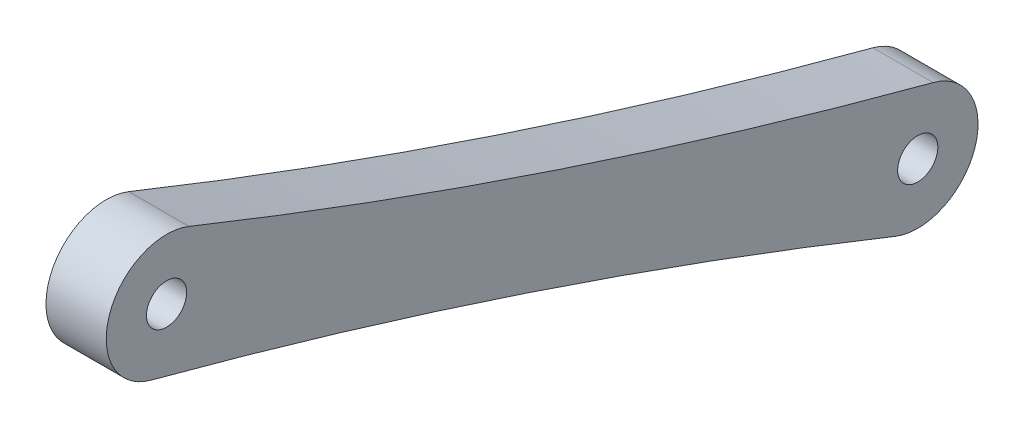
ISO-10303-21;
HEADER;
FILE_DESCRIPTION(('STEP AP214'),'2;1');
FILE_NAME('part.step','',(''),(''),'','','');
FILE_SCHEMA(('AUTOMOTIVE_DESIGN { 1 0 10303 214 1 1 1 1 }'));
ENDSEC;
DATA;
#1=APPLICATION_CONTEXT('core data for automotive mechanical design processes');
#2=APPLICATION_PROTOCOL_DEFINITION('international standard','automotive_design',2000,#1);
#3=PRODUCT_CONTEXT('',#1,'mechanical');
#4=PRODUCT('Part','Part','',(#3));
#5=PRODUCT_RELATED_PRODUCT_CATEGORY('part','',(#4));
#6=PRODUCT_DEFINITION_FORMATION('','',#4);
#7=PRODUCT_DEFINITION_CONTEXT('part definition',#1,'design');
#8=PRODUCT_DEFINITION('design','',#6,#7);
#9=PRODUCT_DEFINITION_SHAPE('','',#8);
#10=(LENGTH_UNIT() NAMED_UNIT(*) SI_UNIT(.MILLI.,.METRE.));
#11=(NAMED_UNIT(*) PLANE_ANGLE_UNIT() SI_UNIT($,.RADIAN.));
#12=(NAMED_UNIT(*) SI_UNIT($,.STERADIAN.) SOLID_ANGLE_UNIT());
#13=UNCERTAINTY_MEASURE_WITH_UNIT(LENGTH_MEASURE(1.E-05),#10,'distance_accuracy_value','');
#14=(GEOMETRIC_REPRESENTATION_CONTEXT(3) GLOBAL_UNCERTAINTY_ASSIGNED_CONTEXT((#13)) GLOBAL_UNIT_ASSIGNED_CONTEXT((#10,
#11,#12)) REPRESENTATION_CONTEXT('',''));
#15=CARTESIAN_POINT('',(0.,0.,0.));
#16=DIRECTION('',(0.,0.,1.));
#17=DIRECTION('',(1.,0.,0.));
#18=AXIS2_PLACEMENT_3D('',#15,#16,#17);
#19=CARTESIAN_POINT('',(4.5,-15.2683405910264,131.347908141366));
#20=DIRECTION('',(1.,0.,0.));
#21=DIRECTION('',(0.,0.,-1.));
#22=AXIS2_PLACEMENT_3D('',#19,#20,#21);
#23=PLANE('',#22);
#24=CARTESIAN_POINT('',(4.5,21.2911288267884,56.9042323272972));
#25=DIRECTION('',(1.,0.,0.));
#26=DIRECTION('',(0.,0.,-1.));
#27=AXIS2_PLACEMENT_3D('',#24,#25,#26);
#28=CIRCLE('',#27,2.);
#29=CARTESIAN_POINT('',(4.5,21.2911288267884,54.9042323272972));
#30=VERTEX_POINT('',#29);
#31=EDGE_CURVE('E145',#30,#30,#28,.T.);
#32=ORIENTED_EDGE('',*,*,#31,.F.);
#33=EDGE_LOOP('',(#32));
#34=FACE_BOUND('',#33,.T.);
#35=CARTESIAN_POINT('',(4.5,46.1615189959735,131.676578103209));
#36=DIRECTION('',(1.,0.,0.));
#37=DIRECTION('',(0.,0.,-1.));
#38=AXIS2_PLACEMENT_3D('',#35,#36,#37);
#39=CIRCLE('',#38,2.);
#40=CARTESIAN_POINT('',(4.5,46.1615189959735,129.676578103209));
#41=VERTEX_POINT('',#40);
#42=EDGE_CURVE('E11',#41,#41,#39,.T.);
#43=ORIENTED_EDGE('',*,*,#42,.F.);
#44=EDGE_LOOP('',(#43));
#45=FACE_BOUND('',#44,.T.);
#46=CARTESIAN_POINT('',(4.500012,-579.563161210761,298.279575587918));
#47=DIRECTION('',(1.,0.,0.));
#48=DIRECTION('',(0.,0.927925231399743,-0.372766367758324));
#49=AXIS2_PLACEMENT_3D('',#46,#47,#48);
#50=CIRCLE('',#49,641.524466094302);
#51=CARTESIAN_POINT('',(4.500006,15.7235774383901,59.1408305338471));
#52=VERTEX_POINT('',#51);
#53=CARTESIAN_POINT('',(4.500006,40.3635171013337,133.220331331466));
#54=VERTEX_POINT('',#53);
#55=EDGE_CURVE('E93',#52,#54,#50,.T.);
#56=ORIENTED_EDGE('',*,*,#55,.F.);
#57=CARTESIAN_POINT('',(4.5,15.7235774383901,59.1408305338471));
#58=CARTESIAN_POINT('',(4.5,15.2610132520388,57.9893720955806));
#59=CARTESIAN_POINT('',(4.5,15.2931536580102,56.7483674027068));
#60=CARTESIAN_POINT('',(4.5,15.3252739648481,55.5081387771579));
#61=CARTESIAN_POINT('',(4.5,15.8472549267216,54.3814883925768));
#62=CARTESIAN_POINT('',(4.5,16.3687944917824,53.2557907245217));
#63=CARTESIAN_POINT('',(4.5,17.2949294543903,52.4286998923748));
#64=CARTESIAN_POINT('',(4.5,18.2202812600406,51.6023084636258));
#65=CARTESIAN_POINT('',(4.5,19.3985517431916,51.2105382731139));
#66=CARTESIAN_POINT('',(4.5,20.5758258588578,50.8190993707782));
#67=CARTESIAN_POINT('',(4.5,21.8128271263633,50.9269561178337));
#68=CARTESIAN_POINT('',(4.5,23.0487823625095,51.0347216592108));
#69=CARTESIAN_POINT('',(4.5,24.1414694367818,51.6245014243988));
#70=CARTESIAN_POINT('',(4.5,25.2332325144706,52.2137824608099));
#71=CARTESIAN_POINT('',(4.5,26.0022485683748,53.1886770820568));
#72=CARTESIAN_POINT('',(4.5,26.7707838957218,54.1629622781397));
#73=CARTESIAN_POINT('',(4.5,27.089730834885,55.3627347594444));
#74=B_SPLINE_CURVE_WITH_KNOTS('',2,(#57,#58,#59,#60,#61,#62,#63,#64,#65,#66,#67,#68,#69,#70,#71,
#72,#73),.UNSPECIFIED.,.F.,.F.,(3,2,2,2,2,2,2,2,3),(0.,0.125,0.25,0.375,0.5,0.625,0.75,0.875,
1.),.UNSPECIFIED.);
#75=CARTESIAN_POINT('',(4.500006,27.089730834885,55.3627347594445));
#76=VERTEX_POINT('',#75);
#77=EDGE_CURVE('E99',#52,#76,#74,.T.);
#78=ORIENTED_EDGE('',*,*,#77,.T.);
#79=CARTESIAN_POINT('',(4.500012,643.112426075408,-108.400442145868));
#80=DIRECTION('',(1.,0.,0.));
#81=DIRECTION('',(0.,-0.927780147297956,0.373127321808231));
#82=AXIS2_PLACEMENT_3D('',#79,#80,#81);
#83=CIRCLE('',#82,637.418496093044);
#84=CARTESIAN_POINT('',(4.500006,51.7281998797612,129.43781417236));
#85=VERTEX_POINT('',#84);
#86=EDGE_CURVE('E142',#85,#76,#83,.T.);
#87=ORIENTED_EDGE('',*,*,#86,.F.);
#88=CARTESIAN_POINT('',(4.5,51.7281998797612,129.43781417236));
#89=CARTESIAN_POINT('',(4.5,52.1912119724456,130.58909257639));
#90=CARTESIAN_POINT('',(4.5,52.1595543455979,131.830109678643));
#91=CARTESIAN_POINT('',(4.5,52.1279165159755,133.07035070582));
#92=CARTESIAN_POINT('',(4.5,51.6063738840846,134.197204066618));
#93=CARTESIAN_POINT('',(4.5,51.0852722783503,135.323104539241));
#94=CARTESIAN_POINT('',(4.5,50.1594591413897,136.150555594622));
#95=CARTESIAN_POINT('',(4.5,49.2344288892583,136.977306941981));
#96=CARTESIAN_POINT('',(4.5,48.0563109020276,137.369535474624));
#97=CARTESIAN_POINT('',(4.5,46.8791891533265,137.761432331509));
#98=CARTESIAN_POINT('',(4.5,45.6421460209102,137.654056811893));
#99=CARTESIAN_POINT('',(4.5,44.4061489552429,137.54677209102));
#100=CARTESIAN_POINT('',(4.5,43.313232527033,136.957417448507));
#101=CARTESIAN_POINT('',(4.5,42.221240289343,136.368561175274));
#102=CARTESIAN_POINT('',(4.5,41.4518450393081,135.393965791076));
#103=CARTESIAN_POINT('',(4.5,40.6829307528644,134.419979644972));
#104=CARTESIAN_POINT('',(4.5,40.3635171013337,133.220331331466));
#105=B_SPLINE_CURVE_WITH_KNOTS('',2,(#88,#89,#90,#91,#92,#93,#94,#95,#96,#97,#98,#99,#100,#101,
#102,#103,#104),.UNSPECIFIED.,.F.,.F.,(3,2,2,2,2,2,2,2,3),(0.,0.125,0.25,0.375,0.5,0.625,0.75,
0.875,1.),.UNSPECIFIED.);
#106=EDGE_CURVE('E65',#85,#54,#105,.T.);
#107=ORIENTED_EDGE('',*,*,#106,.T.);
#108=EDGE_LOOP('',(#56,#78,#87,#107));
#109=FACE_BOUND('',#108,.T.);
#110=ADVANCED_FACE('F42',(#34,#45,#109),#23,.T.);
#111=CARTESIAN_POINT('',(-1.5,-15.2683405910264,131.347908141366));
#112=DIRECTION('',(1.,0.,0.));
#113=DIRECTION('',(0.,0.,-1.));
#114=AXIS2_PLACEMENT_3D('',#111,#112,#113);
#115=PLANE('',#114);
#116=CARTESIAN_POINT('',(-1.5,21.2911288267884,56.9042323272972));
#117=DIRECTION('',(1.,0.,0.));
#118=DIRECTION('',(0.,0.,-1.));
#119=AXIS2_PLACEMENT_3D('',#116,#117,#118);
#120=CIRCLE('',#119,2.);
#121=CARTESIAN_POINT('',(-1.5,21.2911288267884,54.9042323272972));
#122=VERTEX_POINT('',#121);
#123=EDGE_CURVE('E148',#122,#122,#120,.T.);
#124=ORIENTED_EDGE('',*,*,#123,.T.);
#125=EDGE_LOOP('',(#124));
#126=FACE_BOUND('',#125,.T.);
#127=CARTESIAN_POINT('',(-1.5,46.1615189959735,131.676578103209));
#128=DIRECTION('',(1.,0.,0.));
#129=DIRECTION('',(0.,0.,-1.));
#130=AXIS2_PLACEMENT_3D('',#127,#128,#129);
#131=CIRCLE('',#130,2.);
#132=CARTESIAN_POINT('',(-1.5,46.1615189959735,129.676578103209));
#133=VERTEX_POINT('',#132);
#134=EDGE_CURVE('E53',#133,#133,#131,.T.);
#135=ORIENTED_EDGE('',*,*,#134,.T.);
#136=EDGE_LOOP('',(#135));
#137=FACE_BOUND('',#136,.T.);
#138=CARTESIAN_POINT('',(-1.5,21.2911288267884,56.9042323272972));
#139=DIRECTION('',(1.,0.,0.));
#140=DIRECTION('',(0.,0.,-1.));
#141=AXIS2_PLACEMENT_3D('',#138,#139,#140);
#142=CIRCLE('',#141,5.99999999999982);
#143=CARTESIAN_POINT('',(-1.5,15.7235774383901,59.1408305338471));
#144=VERTEX_POINT('',#143);
#145=CARTESIAN_POINT('',(-1.5,27.089730834885,55.3627347594444));
#146=VERTEX_POINT('',#145);
#147=EDGE_CURVE('E223',#144,#146,#142,.T.);
#148=ORIENTED_EDGE('',*,*,#147,.F.);
#149=CARTESIAN_POINT('',(-1.5,-579.563161210761,298.279575587918));
#150=DIRECTION('',(1.,0.,0.));
#151=DIRECTION('',(0.,0.,-1.));
#152=AXIS2_PLACEMENT_3D('',#149,#150,#151);
#153=CIRCLE('',#152,641.524466094302);
#154=CARTESIAN_POINT('',(-1.5,40.3635171013338,133.220331331466));
#155=VERTEX_POINT('',#154);
#156=EDGE_CURVE('E94',#144,#155,#153,.T.);
#157=ORIENTED_EDGE('',*,*,#156,.T.);
#158=CARTESIAN_POINT('',(-1.5,46.1615189959735,131.676578103209));
#159=DIRECTION('',(1.,0.,0.));
#160=DIRECTION('',(0.,0.,-1.));
#161=AXIS2_PLACEMENT_3D('',#158,#159,#160);
#162=CIRCLE('',#161,5.99999999999993);
#163=CARTESIAN_POINT('',(-1.5,51.7281998797612,129.43781417236));
#164=VERTEX_POINT('',#163);
#165=EDGE_CURVE('E229',#164,#155,#162,.T.);
#166=ORIENTED_EDGE('',*,*,#165,.F.);
#167=CARTESIAN_POINT('',(-1.5,643.112426075408,-108.400442145868));
#168=DIRECTION('',(1.,0.,0.));
#169=DIRECTION('',(0.,0.,-1.));
#170=AXIS2_PLACEMENT_3D('',#167,#168,#169);
#171=CIRCLE('',#170,637.418496093044);
#172=EDGE_CURVE('E100',#164,#146,#171,.T.);
#173=ORIENTED_EDGE('',*,*,#172,.T.);
#174=EDGE_LOOP('',(#148,#157,#166,#173));
#175=FACE_BOUND('',#174,.T.);
#176=ADVANCED_FACE('F46',(#126,#137,#175),#115,.F.);
#177=CARTESIAN_POINT('',(4.5,46.1615189959735,131.676578103209));
#178=DIRECTION('',(-1.,0.,0.));
#179=DIRECTION('',(0.,0.,1.));
#180=AXIS2_PLACEMENT_3D('',#177,#178,#179);
#181=CYLINDRICAL_SURFACE('',#180,2.);
#182=ORIENTED_EDGE('',*,*,#42,.T.);
#183=EDGE_LOOP('',(#182));
#184=FACE_BOUND('',#183,.T.);
#185=ORIENTED_EDGE('',*,*,#134,.F.);
#186=EDGE_LOOP('',(#185));
#187=FACE_BOUND('',#186,.T.);
#188=ADVANCED_FACE('F130',(#184,#187),#181,.F.);
#189=CARTESIAN_POINT('',(4.5,21.2911288267884,56.9042323272972));
#190=DIRECTION('',(-1.,0.,0.));
#191=DIRECTION('',(0.,0.,1.));
#192=AXIS2_PLACEMENT_3D('',#189,#190,#191);
#193=CYLINDRICAL_SURFACE('',#192,2.);
#194=ORIENTED_EDGE('',*,*,#31,.T.);
#195=EDGE_LOOP('',(#194));
#196=FACE_BOUND('',#195,.T.);
#197=ORIENTED_EDGE('',*,*,#123,.F.);
#198=EDGE_LOOP('',(#197));
#199=FACE_BOUND('',#198,.T.);
#200=ADVANCED_FACE('F207',(#196,#199),#193,.F.);
#201=CARTESIAN_POINT('',(-1.5,21.2911288267884,56.9042323272972));
#202=DIRECTION('',(1.,0.,0.));
#203=DIRECTION('',(0.,0.,-1.));
#204=AXIS2_PLACEMENT_3D('',#201,#202,#203);
#205=CYLINDRICAL_SURFACE('',#204,5.99999999999982);
#206=DIRECTION('',(1.,0.,0.));
#207=VECTOR('',#206,1.);
#208=CARTESIAN_POINT('',(-1.5,15.7235774383901,59.1408305338471));
#209=LINE('',#208,#207);
#210=EDGE_CURVE('E87',#144,#52,#209,.T.);
#211=ORIENTED_EDGE('',*,*,#210,.F.);
#212=ORIENTED_EDGE('',*,*,#147,.T.);
#213=DIRECTION('',(1.,0.,0.));
#214=VECTOR('',#213,1.);
#215=CARTESIAN_POINT('',(-1.5,27.089730834885,55.3627347594444));
#216=LINE('',#215,#214);
#217=EDGE_CURVE('E102',#146,#76,#216,.T.);
#218=ORIENTED_EDGE('',*,*,#217,.T.);
#219=ORIENTED_EDGE('',*,*,#77,.F.);
#220=EDGE_LOOP('',(#211,#212,#218,#219));
#221=FACE_BOUND('',#220,.T.);
#222=ADVANCED_FACE('F105',(#221),#205,.T.);
#223=CARTESIAN_POINT('',(-1.5,643.112426075408,-108.400442145868));
#224=DIRECTION('',(1.,0.,0.));
#225=DIRECTION('',(0.,0.,-1.));
#226=AXIS2_PLACEMENT_3D('',#223,#224,#225);
#227=CYLINDRICAL_SURFACE('',#226,637.418496093044);
#228=ORIENTED_EDGE('',*,*,#217,.F.);
#229=ORIENTED_EDGE('',*,*,#172,.F.);
#230=DIRECTION('',(1.,0.,0.));
#231=VECTOR('',#230,1.);
#232=CARTESIAN_POINT('',(-1.5,51.7281998797612,129.43781417236));
#233=LINE('',#232,#231);
#234=EDGE_CURVE('E179',#164,#85,#233,.T.);
#235=ORIENTED_EDGE('',*,*,#234,.T.);
#236=ORIENTED_EDGE('',*,*,#86,.T.);
#237=EDGE_LOOP('',(#228,#229,#235,#236));
#238=FACE_BOUND('',#237,.T.);
#239=ADVANCED_FACE('F156',(#238),#227,.F.);
#240=CARTESIAN_POINT('',(-1.5,46.1615189959735,131.676578103209));
#241=DIRECTION('',(1.,0.,0.));
#242=DIRECTION('',(0.,0.,-1.));
#243=AXIS2_PLACEMENT_3D('',#240,#241,#242);
#244=CYLINDRICAL_SURFACE('',#243,5.99999999999993);
#245=ORIENTED_EDGE('',*,*,#234,.F.);
#246=ORIENTED_EDGE('',*,*,#165,.T.);
#247=DIRECTION('',(1.,0.,0.));
#248=VECTOR('',#247,1.);
#249=CARTESIAN_POINT('',(-1.5,40.3635171013337,133.220331331466));
#250=LINE('',#249,#248);
#251=EDGE_CURVE('E66',#155,#54,#250,.T.);
#252=ORIENTED_EDGE('',*,*,#251,.T.);
#253=ORIENTED_EDGE('',*,*,#106,.F.);
#254=EDGE_LOOP('',(#245,#246,#252,#253));
#255=FACE_BOUND('',#254,.T.);
#256=ADVANCED_FACE('F164',(#255),#244,.T.);
#257=CARTESIAN_POINT('',(-1.5,-579.563161210761,298.279575587918));
#258=DIRECTION('',(1.,0.,0.));
#259=DIRECTION('',(0.,0.,-1.));
#260=AXIS2_PLACEMENT_3D('',#257,#258,#259);
#261=CYLINDRICAL_SURFACE('',#260,641.524466094302);
#262=ORIENTED_EDGE('',*,*,#251,.F.);
#263=ORIENTED_EDGE('',*,*,#156,.F.);
#264=ORIENTED_EDGE('',*,*,#210,.T.);
#265=ORIENTED_EDGE('',*,*,#55,.T.);
#266=EDGE_LOOP('',(#262,#263,#264,#265));
#267=FACE_BOUND('',#266,.T.);
#268=ADVANCED_FACE('F90',(#267),#261,.F.);
#269=CLOSED_SHELL('',(#110,#176,#188,#200,#222,#239,#256,#268));
#270=MANIFOLD_SOLID_BREP('B2',#269);
#271=ADVANCED_BREP_SHAPE_REPRESENTATION('',(#18,#270),#14);
#272=SHAPE_DEFINITION_REPRESENTATION(#9,#271);
ENDSEC;
END-ISO-10303-21;
